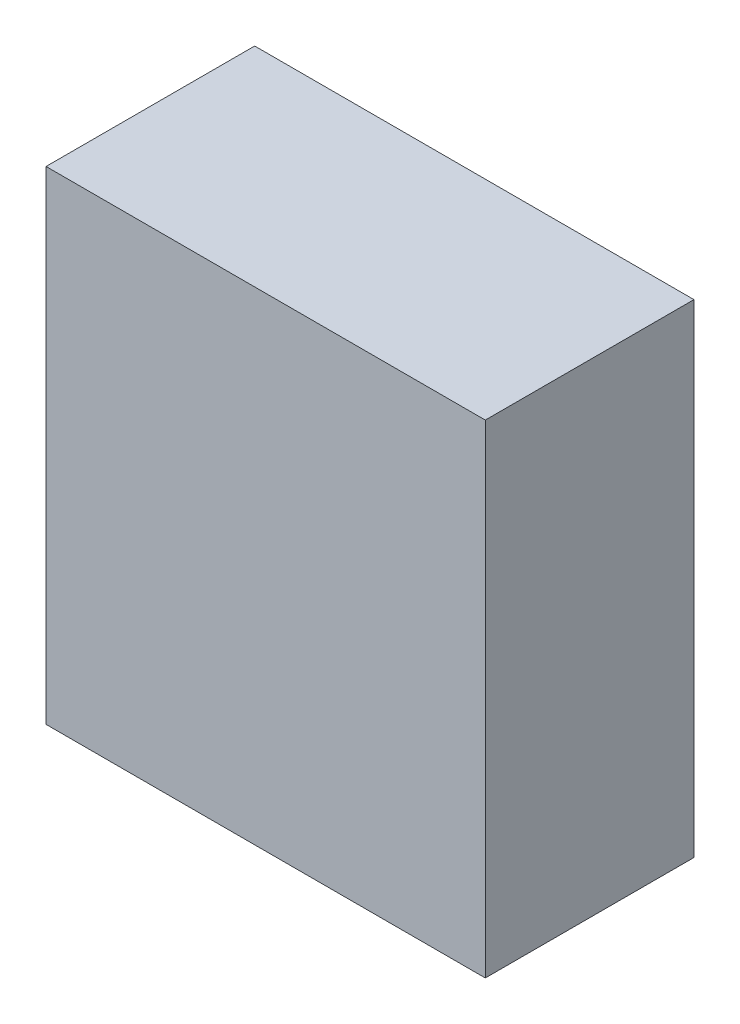
ISO-10303-21;
HEADER;
FILE_DESCRIPTION(('STEP AP214'),'2;1');
FILE_NAME('part.step','',(''),(''),'','','');
FILE_SCHEMA(('AUTOMOTIVE_DESIGN { 1 0 10303 214 1 1 1 1 }'));
ENDSEC;
DATA;
#1=APPLICATION_CONTEXT('core data for automotive mechanical design processes');
#2=APPLICATION_PROTOCOL_DEFINITION('international standard','automotive_design',2000,#1);
#3=PRODUCT_CONTEXT('',#1,'mechanical');
#4=PRODUCT('Part','Part','',(#3));
#5=PRODUCT_RELATED_PRODUCT_CATEGORY('part','',(#4));
#6=PRODUCT_DEFINITION_FORMATION('','',#4);
#7=PRODUCT_DEFINITION_CONTEXT('part definition',#1,'design');
#8=PRODUCT_DEFINITION('design','',#6,#7);
#9=PRODUCT_DEFINITION_SHAPE('','',#8);
#10=(LENGTH_UNIT() NAMED_UNIT(*) SI_UNIT(.MILLI.,.METRE.));
#11=(NAMED_UNIT(*) PLANE_ANGLE_UNIT() SI_UNIT($,.RADIAN.));
#12=(NAMED_UNIT(*) SI_UNIT($,.STERADIAN.) SOLID_ANGLE_UNIT());
#13=UNCERTAINTY_MEASURE_WITH_UNIT(LENGTH_MEASURE(1.E-05),#10,'distance_accuracy_value','');
#14=(GEOMETRIC_REPRESENTATION_CONTEXT(3) GLOBAL_UNCERTAINTY_ASSIGNED_CONTEXT((#13)) GLOBAL_UNIT_ASSIGNED_CONTEXT((#10,
#11,#12)) REPRESENTATION_CONTEXT('',''));
#15=CARTESIAN_POINT('',(0.,0.,0.));
#16=DIRECTION('',(0.,0.,1.));
#17=DIRECTION('',(1.,0.,0.));
#18=AXIS2_PLACEMENT_3D('',#15,#16,#17);
#19=CARTESIAN_POINT('',(-400.,-440.,380.));
#20=DIRECTION('',(0.,1.,0.));
#21=DIRECTION('',(0.,0.,1.));
#22=AXIS2_PLACEMENT_3D('',#19,#20,#21);
#23=PLANE('',#22);
#24=DIRECTION('',(1.,0.,0.));
#25=VECTOR('',#24,1.);
#26=CARTESIAN_POINT('',(-400.,-440.,0.));
#27=LINE('',#26,#25);
#28=CARTESIAN_POINT('',(-400.,-440.,0.));
#29=VERTEX_POINT('',#28);
#30=CARTESIAN_POINT('',(400.,-440.,0.));
#31=VERTEX_POINT('',#30);
#32=EDGE_CURVE('E96',#29,#31,#27,.T.);
#33=ORIENTED_EDGE('',*,*,#32,.T.);
#34=DIRECTION('',(0.,0.,-1.));
#35=VECTOR('',#34,1.);
#36=CARTESIAN_POINT('',(400.,-440.,380.));
#37=LINE('',#36,#35);
#38=CARTESIAN_POINT('',(400.,-440.,380.));
#39=VERTEX_POINT('',#38);
#40=EDGE_CURVE('E11',#39,#31,#37,.T.);
#41=ORIENTED_EDGE('',*,*,#40,.F.);
#42=DIRECTION('',(1.,0.,0.));
#43=VECTOR('',#42,1.);
#44=CARTESIAN_POINT('',(-400.,-440.,380.));
#45=LINE('',#44,#43);
#46=CARTESIAN_POINT('',(-400.,-440.,380.));
#47=VERTEX_POINT('',#46);
#48=EDGE_CURVE('E73',#47,#39,#45,.T.);
#49=ORIENTED_EDGE('',*,*,#48,.F.);
#50=DIRECTION('',(0.,0.,-1.));
#51=VECTOR('',#50,1.);
#52=CARTESIAN_POINT('',(-400.,-440.,380.));
#53=LINE('',#52,#51);
#54=EDGE_CURVE('E92',#47,#29,#53,.T.);
#55=ORIENTED_EDGE('',*,*,#54,.T.);
#56=EDGE_LOOP('',(#33,#41,#49,#55));
#57=FACE_BOUND('',#56,.T.);
#58=ADVANCED_FACE('F34',(#57),#23,.F.);
#59=CARTESIAN_POINT('',(400.,440.,380.));
#60=DIRECTION('',(1.,0.,0.));
#61=DIRECTION('',(0.,0.,-1.));
#62=AXIS2_PLACEMENT_3D('',#59,#60,#61);
#63=PLANE('',#62);
#64=DIRECTION('',(0.,-1.,0.));
#65=VECTOR('',#64,1.);
#66=CARTESIAN_POINT('',(400.,440.,0.));
#67=LINE('',#66,#65);
#68=CARTESIAN_POINT('',(400.,440.,0.));
#69=VERTEX_POINT('',#68);
#70=EDGE_CURVE('E82',#69,#31,#67,.T.);
#71=ORIENTED_EDGE('',*,*,#70,.F.);
#72=DIRECTION('',(0.,0.,-1.));
#73=VECTOR('',#72,1.);
#74=CARTESIAN_POINT('',(400.,440.,380.));
#75=LINE('',#74,#73);
#76=CARTESIAN_POINT('',(400.,440.,380.));
#77=VERTEX_POINT('',#76);
#78=EDGE_CURVE('E42',#77,#69,#75,.T.);
#79=ORIENTED_EDGE('',*,*,#78,.F.);
#80=DIRECTION('',(0.,-1.,0.));
#81=VECTOR('',#80,1.);
#82=CARTESIAN_POINT('',(400.,440.,380.));
#83=LINE('',#82,#81);
#84=EDGE_CURVE('E80',#77,#39,#83,.T.);
#85=ORIENTED_EDGE('',*,*,#84,.T.);
#86=ORIENTED_EDGE('',*,*,#40,.T.);
#87=EDGE_LOOP('',(#71,#79,#85,#86));
#88=FACE_BOUND('',#87,.T.);
#89=ADVANCED_FACE('F79',(#88),#63,.T.);
#90=CARTESIAN_POINT('',(-400.,440.,380.));
#91=DIRECTION('',(0.,1.,0.));
#92=DIRECTION('',(0.,0.,1.));
#93=AXIS2_PLACEMENT_3D('',#90,#91,#92);
#94=PLANE('',#93);
#95=DIRECTION('',(1.,0.,0.));
#96=VECTOR('',#95,1.);
#97=CARTESIAN_POINT('',(-400.,440.,0.));
#98=LINE('',#97,#96);
#99=CARTESIAN_POINT('',(-400.,440.,0.));
#100=VERTEX_POINT('',#99);
#101=EDGE_CURVE('E100',#100,#69,#98,.T.);
#102=ORIENTED_EDGE('',*,*,#101,.F.);
#103=DIRECTION('',(0.,0.,-1.));
#104=VECTOR('',#103,1.);
#105=CARTESIAN_POINT('',(-400.,440.,380.));
#106=LINE('',#105,#104);
#107=CARTESIAN_POINT('',(-400.,440.,380.));
#108=VERTEX_POINT('',#107);
#109=EDGE_CURVE('E65',#108,#100,#106,.T.);
#110=ORIENTED_EDGE('',*,*,#109,.F.);
#111=DIRECTION('',(1.,0.,0.));
#112=VECTOR('',#111,1.);
#113=CARTESIAN_POINT('',(-400.,440.,380.));
#114=LINE('',#113,#112);
#115=EDGE_CURVE('E88',#108,#77,#114,.T.);
#116=ORIENTED_EDGE('',*,*,#115,.T.);
#117=ORIENTED_EDGE('',*,*,#78,.T.);
#118=EDGE_LOOP('',(#102,#110,#116,#117));
#119=FACE_BOUND('',#118,.T.);
#120=ADVANCED_FACE('F90',(#119),#94,.T.);
#121=CARTESIAN_POINT('',(-400.,440.,380.));
#122=DIRECTION('',(1.,0.,0.));
#123=DIRECTION('',(0.,0.,-1.));
#124=AXIS2_PLACEMENT_3D('',#121,#122,#123);
#125=PLANE('',#124);
#126=DIRECTION('',(0.,-1.,0.));
#127=VECTOR('',#126,1.);
#128=CARTESIAN_POINT('',(-400.,440.,0.));
#129=LINE('',#128,#127);
#130=EDGE_CURVE('E68',#100,#29,#129,.T.);
#131=ORIENTED_EDGE('',*,*,#130,.T.);
#132=ORIENTED_EDGE('',*,*,#54,.F.);
#133=DIRECTION('',(0.,-1.,0.));
#134=VECTOR('',#133,1.);
#135=CARTESIAN_POINT('',(-400.,440.,380.));
#136=LINE('',#135,#134);
#137=EDGE_CURVE('E50',#108,#47,#136,.T.);
#138=ORIENTED_EDGE('',*,*,#137,.F.);
#139=ORIENTED_EDGE('',*,*,#109,.T.);
#140=EDGE_LOOP('',(#131,#132,#138,#139));
#141=FACE_BOUND('',#140,.T.);
#142=ADVANCED_FACE('F113',(#141),#125,.F.);
#143=CARTESIAN_POINT('',(0.,0.,380.));
#144=DIRECTION('',(0.,0.,-1.));
#145=DIRECTION('',(-1.,0.,0.));
#146=AXIS2_PLACEMENT_3D('',#143,#144,#145);
#147=PLANE('',#146);
#148=ORIENTED_EDGE('',*,*,#48,.T.);
#149=ORIENTED_EDGE('',*,*,#84,.F.);
#150=ORIENTED_EDGE('',*,*,#115,.F.);
#151=ORIENTED_EDGE('',*,*,#137,.T.);
#152=EDGE_LOOP('',(#148,#149,#150,#151));
#153=FACE_BOUND('',#152,.T.);
#154=ADVANCED_FACE('F87',(#153),#147,.F.);
#155=CARTESIAN_POINT('',(0.,0.,0.));
#156=DIRECTION('',(0.,0.,-1.));
#157=DIRECTION('',(-1.,0.,0.));
#158=AXIS2_PLACEMENT_3D('',#155,#156,#157);
#159=PLANE('',#158);
#160=ORIENTED_EDGE('',*,*,#32,.F.);
#161=ORIENTED_EDGE('',*,*,#130,.F.);
#162=ORIENTED_EDGE('',*,*,#101,.T.);
#163=ORIENTED_EDGE('',*,*,#70,.T.);
#164=EDGE_LOOP('',(#160,#161,#162,#163));
#165=FACE_BOUND('',#164,.T.);
#166=ADVANCED_FACE('F107',(#165),#159,.T.);
#167=CLOSED_SHELL('',(#58,#89,#120,#142,#154,#166));
#168=MANIFOLD_SOLID_BREP('B2',#167);
#169=ADVANCED_BREP_SHAPE_REPRESENTATION('',(#18,#168),#14);
#170=SHAPE_DEFINITION_REPRESENTATION(#9,#169);
ENDSEC;
END-ISO-10303-21;
